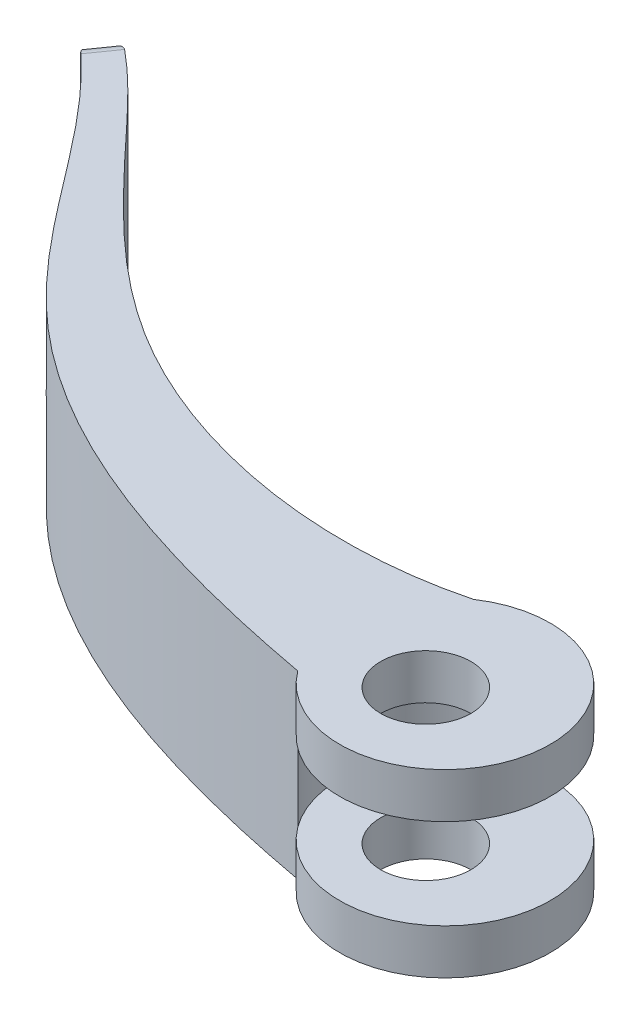
ISO-10303-21;
HEADER;
FILE_DESCRIPTION(('STEP AP214'),'2;1');
FILE_NAME('part.step','',(''),(''),'','','');
FILE_SCHEMA(('AUTOMOTIVE_DESIGN { 1 0 10303 214 1 1 1 1 }'));
ENDSEC;
DATA;
#1=APPLICATION_CONTEXT('core data for automotive mechanical design processes');
#2=APPLICATION_PROTOCOL_DEFINITION('international standard','automotive_design',2000,#1);
#3=PRODUCT_CONTEXT('',#1,'mechanical');
#4=PRODUCT('Part','Part','',(#3));
#5=PRODUCT_RELATED_PRODUCT_CATEGORY('part','',(#4));
#6=PRODUCT_DEFINITION_FORMATION('','',#4);
#7=PRODUCT_DEFINITION_CONTEXT('part definition',#1,'design');
#8=PRODUCT_DEFINITION('design','',#6,#7);
#9=PRODUCT_DEFINITION_SHAPE('','',#8);
#10=(LENGTH_UNIT() NAMED_UNIT(*) SI_UNIT(.MILLI.,.METRE.));
#11=(NAMED_UNIT(*) PLANE_ANGLE_UNIT() SI_UNIT($,.RADIAN.));
#12=(NAMED_UNIT(*) SI_UNIT($,.STERADIAN.) SOLID_ANGLE_UNIT());
#13=UNCERTAINTY_MEASURE_WITH_UNIT(LENGTH_MEASURE(1.E-05),#10,'distance_accuracy_value','');
#14=(GEOMETRIC_REPRESENTATION_CONTEXT(3) GLOBAL_UNCERTAINTY_ASSIGNED_CONTEXT((#13)) GLOBAL_UNIT_ASSIGNED_CONTEXT((#10,
#11,#12)) REPRESENTATION_CONTEXT('',''));
#15=CARTESIAN_POINT('',(0.,0.,0.));
#16=DIRECTION('',(0.,0.,1.));
#17=DIRECTION('',(1.,0.,0.));
#18=AXIS2_PLACEMENT_3D('',#15,#16,#17);
#19=CARTESIAN_POINT('',(0.,12.,0.));
#20=DIRECTION('',(0.,-1.,0.));
#21=DIRECTION('',(0.,0.,-1.));
#22=AXIS2_PLACEMENT_3D('',#19,#20,#21);
#23=CYLINDRICAL_SURFACE('',#22,7.);
#24=DIRECTION('',(0.,-1.,0.));
#25=VECTOR('',#24,1.);
#26=CARTESIAN_POINT('',(-3.90861040379885,12.,-5.80713050579332));
#27=LINE('',#26,#25);
#28=CARTESIAN_POINT('',(-3.90861040379885,9.,-5.80713050579332));
#29=VERTEX_POINT('',#28);
#30=CARTESIAN_POINT('',(-3.90861040379885,3.,-5.80713050579332));
#31=VERTEX_POINT('',#30);
#32=EDGE_CURVE('E229',#29,#31,#27,.T.);
#33=ORIENTED_EDGE('',*,*,#32,.F.);
#34=CARTESIAN_POINT('',(0.,9.,0.));
#35=DIRECTION('',(0.,1.,0.));
#36=DIRECTION('',(0.,0.,1.));
#37=AXIS2_PLACEMENT_3D('',#34,#35,#36);
#38=CIRCLE('',#37,7.);
#39=CARTESIAN_POINT('',(-5.63038455934891,9.,4.15917897112464));
#40=VERTEX_POINT('',#39);
#41=EDGE_CURVE('E147',#29,#40,#38,.T.);
#42=ORIENTED_EDGE('',*,*,#41,.T.);
#43=DIRECTION('',(0.,-1.,0.));
#44=VECTOR('',#43,1.);
#45=CARTESIAN_POINT('',(-5.63038455934891,12.,4.15917897112464));
#46=LINE('',#45,#44);
#47=CARTESIAN_POINT('',(-5.63038455934891,3.,4.15917897112464));
#48=VERTEX_POINT('',#47);
#49=EDGE_CURVE('E134',#40,#48,#46,.T.);
#50=ORIENTED_EDGE('',*,*,#49,.T.);
#51=CARTESIAN_POINT('',(0.,3.,0.));
#52=DIRECTION('',(0.,1.,0.));
#53=DIRECTION('',(0.,0.,1.));
#54=AXIS2_PLACEMENT_3D('',#51,#52,#53);
#55=CIRCLE('',#54,7.);
#56=EDGE_CURVE('E159',#31,#48,#55,.T.);
#57=ORIENTED_EDGE('',*,*,#56,.F.);
#58=EDGE_LOOP('',(#33,#42,#50,#57));
#59=FACE_BOUND('',#58,.T.);
#60=ADVANCED_FACE('F43',(#59),#23,.F.);
#61=CARTESIAN_POINT('',(-44.5893770504058,12.,-31.3195726277203));
#62=DIRECTION('',(0.818308254116617,0.,0.57477961102027));
#63=DIRECTION('',(0.57477961102027,0.,-0.818308254116617));
#64=AXIS2_PLACEMENT_3D('',#61,#62,#63);
#65=PLANE('',#64);
#66=DIRECTION('',(-0.57477961102027,0.,0.818308254116617));
#67=VECTOR('',#66,1.);
#68=CARTESIAN_POINT('',(-47.9872952444347,11.,-26.4819888796621));
#69=LINE('',#68,#67);
#70=CARTESIAN_POINT('',(-48.6260177744178,11.,-25.5726457012435));
#71=VERTEX_POINT('',#70);
#72=CARTESIAN_POINT('',(-48.5827554730586,11.,-25.6342378273655));
#73=VERTEX_POINT('',#72);
#74=EDGE_CURVE('E390',#71,#73,#69,.F.);
#75=ORIENTED_EDGE('',*,*,#74,.T.);
#76=DIRECTION('',(0.,-1.,0.));
#77=VECTOR('',#76,1.);
#78=CARTESIAN_POINT('',(-48.5827554730586,12.,-25.6342378273655));
#79=LINE('',#78,#77);
#80=CARTESIAN_POINT('',(-48.5827554730586,1.,-25.6342378273655));
#81=VERTEX_POINT('',#80);
#82=EDGE_CURVE('E387',#73,#81,#79,.T.);
#83=ORIENTED_EDGE('',*,*,#82,.T.);
#84=DIRECTION('',(-0.57477961102027,0.,0.818308254116617));
#85=VECTOR('',#84,1.);
#86=CARTESIAN_POINT('',(-44.5893770504058,1.,-31.3195726277203));
#87=LINE('',#86,#85);
#88=CARTESIAN_POINT('',(-48.6260177744178,1.,-25.5726457012435));
#89=VERTEX_POINT('',#88);
#90=EDGE_CURVE('E138',#81,#89,#87,.T.);
#91=ORIENTED_EDGE('',*,*,#90,.T.);
#92=DIRECTION('',(0.,-1.,0.));
#93=VECTOR('',#92,1.);
#94=CARTESIAN_POINT('',(-48.6260177744178,12.,-25.5726457012435));
#95=LINE('',#94,#93);
#96=EDGE_CURVE('E372',#89,#71,#95,.F.);
#97=ORIENTED_EDGE('',*,*,#96,.T.);
#98=EDGE_LOOP('',(#75,#83,#91,#97));
#99=FACE_BOUND('',#98,.T.);
#100=ADVANCED_FACE('F189',(#99),#65,.F.);
#101=CARTESIAN_POINT('',(-49.1368544664753,12.,-24.8453723714289));
#102=CARTESIAN_POINT('',(-44.8088827793375,12.,-21.0865027980637));
#103=CARTESIAN_POINT('',(-40.7588190828675,12.,-14.5144830318843));
#104=CARTESIAN_POINT('',(-28.4427027708269,12.,-1.36293619522041));
#105=CARTESIAN_POINT('',(-15.6287580696251,12.,2.30796027114866));
#106=CARTESIAN_POINT('',(-5.63038455934891,12.,4.15917897112464));
#107=B_SPLINE_CURVE_WITH_KNOTS('',3,(#101,#102,#103,#104,#105,#106),.UNSPECIFIED.,.F.,.F.,(4,1,
1,4),(0.,0.315330411179741,0.428800604638553,1.),.UNSPECIFIED.);
#108=DIRECTION('',(0.,-1.,0.));
#109=VECTOR('',#108,1.);
#110=SURFACE_OF_LINEAR_EXTRUSION('',#107,#109);
#111=CARTESIAN_POINT('',(-48.3876960997107,12.,-24.1721447248371));
#112=VERTEX_POINT('',#111);
#113=CARTESIAN_POINT('',(-5.63038455934891,12.,4.15917897112464));
#114=VERTEX_POINT('',#113);
#115=EDGE_CURVE('E117',#112,#114,#107,.T.);
#116=ORIENTED_EDGE('',*,*,#115,.F.);
#117=CARTESIAN_POINT('',(-48.3876960997107,12.,-24.1721447248372));
#118=CARTESIAN_POINT('',(-48.4039805215978,11.9999989486895,-24.1872718974303));
#119=CARTESIAN_POINT('',(-48.4202461472935,11.9992737020706,-24.2023495428294));
#120=CARTESIAN_POINT('',(-48.4527398063021,11.9963748182161,-24.2324057792396));
#121=CARTESIAN_POINT('',(-48.468967839615,11.9942011809804,-24.2473843702506));
#122=CARTESIAN_POINT('',(-48.4851770767365,11.9913033484363,-24.2623134340676));
#123=B_SPLINE_CURVE_WITH_KNOTS('',3,(#117,#118,#119,#120,#121,#122),.UNSPECIFIED.,.F.,.F.,(4,2,
4),(0.,0.0665724235281247,0.133144847056246),.UNSPECIFIED.);
#124=CARTESIAN_POINT('',(-48.4851770767365,11.9913033484363,-24.2623134340676));
#125=VERTEX_POINT('',#124);
#126=EDGE_CURVE('E12',#112,#125,#123,.T.);
#127=ORIENTED_EDGE('',*,*,#126,.T.);
#128=DIRECTION('',(0.,-1.,0.));
#129=VECTOR('',#128,1.);
#130=CARTESIAN_POINT('',(-48.4851770767365,12.,-24.2623134340676));
#131=LINE('',#130,#129);
#132=CARTESIAN_POINT('',(-48.4851770767365,0.00869665156371345,-24.2623134340676));
#133=VERTEX_POINT('',#132);
#134=EDGE_CURVE('E52',#125,#133,#131,.T.);
#135=ORIENTED_EDGE('',*,*,#134,.T.);
#136=CARTESIAN_POINT('',(-48.4851770767365,0.00869665156371345,-24.2623134340676));
#137=CARTESIAN_POINT('',(-48.468967839615,0.00579881901961597,-24.2473843702506));
#138=CARTESIAN_POINT('',(-48.4527398063021,0.00362518178392379,-24.2324057792396));
#139=CARTESIAN_POINT('',(-48.4202461472935,0.000726297929350095,-24.2023495428294));
#140=CARTESIAN_POINT('',(-48.4039805215978,1.05131046852138E-06,-24.1872718974303));
#141=CARTESIAN_POINT('',(-48.3876960997107,0.,-24.1721447248371));
#142=B_SPLINE_CURVE_WITH_KNOTS('',3,(#136,#137,#138,#139,#140,#141),.UNSPECIFIED.,.F.,.F.,(4,2,
4),(0.,0.0665724235281319,0.133144847056261),.UNSPECIFIED.);
#143=CARTESIAN_POINT('',(-48.3876960963881,0.,-24.1721447217506));
#144=VERTEX_POINT('',#143);
#145=EDGE_CURVE('E194',#133,#144,#142,.T.);
#146=ORIENTED_EDGE('',*,*,#145,.T.);
#147=CARTESIAN_POINT('',(-49.1368544664753,0.,-24.8453723714289));
#148=CARTESIAN_POINT('',(-44.8088827793375,0.,-21.0865027980637));
#149=CARTESIAN_POINT('',(-40.7588190828675,0.,-14.5144830318843));
#150=CARTESIAN_POINT('',(-28.4427027708269,0.,-1.36293619522041));
#151=CARTESIAN_POINT('',(-15.6287580696251,0.,2.30796027114866));
#152=CARTESIAN_POINT('',(-5.63038455934891,0.,4.15917897112464));
#153=B_SPLINE_CURVE_WITH_KNOTS('',3,(#147,#148,#149,#150,#151,#152),.UNSPECIFIED.,.F.,.F.,(4,1,
1,4),(0.,0.315330411179741,0.428800604638553,1.),.UNSPECIFIED.);
#154=CARTESIAN_POINT('',(-5.63038455934891,0.,4.15917897112464));
#155=VERTEX_POINT('',#154);
#156=EDGE_CURVE('E171',#144,#155,#153,.T.);
#157=ORIENTED_EDGE('',*,*,#156,.T.);
#158=DIRECTION('',(0.,-1.,0.));
#159=VECTOR('',#158,1.);
#160=CARTESIAN_POINT('',(-5.63038455934891,12.,4.15917897112464));
#161=LINE('',#160,#159);
#162=EDGE_CURVE('E169',#48,#155,#161,.T.);
#163=ORIENTED_EDGE('',*,*,#162,.F.);
#164=ORIENTED_EDGE('',*,*,#49,.F.);
#165=EDGE_CURVE('E131',#114,#40,#46,.T.);
#166=ORIENTED_EDGE('',*,*,#165,.F.);
#167=EDGE_LOOP('',(#116,#127,#135,#146,#157,#163,#164,#166));
#168=FACE_BOUND('',#167,.T.);
#169=ADVANCED_FACE('F132',(#168),#110,.F.);
#170=CARTESIAN_POINT('',(-3.90861040379885,12.,-5.80713050579332));
#171=CARTESIAN_POINT('',(-12.3800110490483,12.,-3.60562188356051));
#172=CARTESIAN_POINT('',(-27.3765794382472,12.,-6.3175591992749));
#173=CARTESIAN_POINT('',(-39.425413050532,12.,-17.7730453391979));
#174=CARTESIAN_POINT('',(-45.6587175545161,12.,-24.8463962138069));
#175=CARTESIAN_POINT('',(-47.9872952444347,12.,-26.4819888796621));
#176=B_SPLINE_CURVE_WITH_KNOTS('',3,(#170,#171,#172,#173,#174,#175),.UNSPECIFIED.,.F.,.F.,(4,1,
1,4),(0.,0.514096191177697,0.795654463109284,1.),.UNSPECIFIED.);
#177=DIRECTION('',(0.,-1.,0.));
#178=VECTOR('',#177,1.);
#179=SURFACE_OF_LINEAR_EXTRUSION('',#176,#178);
#180=CARTESIAN_POINT('',(-3.90861040379885,0.,-5.80713050579332));
#181=CARTESIAN_POINT('',(-12.3800110490483,0.,-3.60562188356051));
#182=CARTESIAN_POINT('',(-27.3765794382472,0.,-6.3175591992749));
#183=CARTESIAN_POINT('',(-39.425413050532,0.,-17.7730453391979));
#184=CARTESIAN_POINT('',(-45.6587175545161,0.,-24.8463962138069));
#185=CARTESIAN_POINT('',(-47.9872952444347,0.,-26.4819888796621));
#186=B_SPLINE_CURVE_WITH_KNOTS('',3,(#180,#181,#182,#183,#184,#185),.UNSPECIFIED.,.F.,.F.,(4,1,
1,4),(0.,0.514096191177697,0.795654463109284,1.),.UNSPECIFIED.);
#187=CARTESIAN_POINT('',(-3.90861040379885,0.,-5.80713050579332));
#188=VERTEX_POINT('',#187);
#189=CARTESIAN_POINT('',(-47.1359589404355,0.,-25.837277272283));
#190=VERTEX_POINT('',#189);
#191=EDGE_CURVE('E127',#188,#190,#186,.T.);
#192=ORIENTED_EDGE('',*,*,#191,.T.);
#193=DIRECTION('',(0.,-1.,0.));
#194=VECTOR('',#193,1.);
#195=CARTESIAN_POINT('',(-47.1359589404355,0.,-25.837277272283));
#196=LINE('',#195,#194);
#197=CARTESIAN_POINT('',(-47.1359589404355,12.,-25.837277272283));
#198=VERTEX_POINT('',#197);
#199=EDGE_CURVE('E380',#190,#198,#196,.F.);
#200=ORIENTED_EDGE('',*,*,#199,.T.);
#201=CARTESIAN_POINT('',(-3.90861040379885,12.,-5.80713050579332));
#202=VERTEX_POINT('',#201);
#203=EDGE_CURVE('E126',#202,#198,#176,.T.);
#204=ORIENTED_EDGE('',*,*,#203,.F.);
#205=EDGE_CURVE('E143',#202,#29,#27,.T.);
#206=ORIENTED_EDGE('',*,*,#205,.T.);
#207=ORIENTED_EDGE('',*,*,#32,.T.);
#208=DIRECTION('',(0.,-1.,0.));
#209=VECTOR('',#208,1.);
#210=CARTESIAN_POINT('',(-3.90861040379885,12.,-5.80713050579332));
#211=LINE('',#210,#209);
#212=EDGE_CURVE('E162',#188,#31,#211,.F.);
#213=ORIENTED_EDGE('',*,*,#212,.F.);
#214=EDGE_LOOP('',(#192,#200,#204,#206,#207,#213));
#215=FACE_BOUND('',#214,.T.);
#216=ADVANCED_FACE('F188',(#215),#179,.F.);
#217=CARTESIAN_POINT('',(0.,12.,0.));
#218=DIRECTION('',(0.,1.,0.));
#219=DIRECTION('',(0.,0.,1.));
#220=AXIS2_PLACEMENT_3D('',#217,#218,#219);
#221=PLANE('',#220);
#222=ORIENTED_EDGE('',*,*,#203,.T.);
#223=CARTESIAN_POINT('',(-47.764447218942,12.,-25.0594582163452));
#224=DIRECTION('',(0.,1.,0.));
#225=DIRECTION('',(0.,0.,1.));
#226=AXIS2_PLACEMENT_3D('',#223,#224,#225);
#227=CIRCLE('',#226,1.);
#228=CARTESIAN_POINT('',(-47.1896676079217,12.,-25.8777664704618));
#229=VERTEX_POINT('',#228);
#230=EDGE_CURVE('E379',#198,#229,#227,.T.);
#231=ORIENTED_EDGE('',*,*,#230,.T.);
#232=DIRECTION('',(-0.57477961102027,0.,0.818308254116617));
#233=VECTOR('',#232,1.);
#234=CARTESIAN_POINT('',(-48.3185462123586,12.,-24.2705927604086));
#235=LINE('',#234,#233);
#236=EDGE_CURVE('E125',#229,#112,#235,.T.);
#237=ORIENTED_EDGE('',*,*,#236,.T.);
#238=ORIENTED_EDGE('',*,*,#115,.T.);
#239=CARTESIAN_POINT('',(0.,12.,0.));
#240=DIRECTION('',(0.,1.,0.));
#241=DIRECTION('',(0.,0.,1.));
#242=AXIS2_PLACEMENT_3D('',#239,#240,#241);
#243=CIRCLE('',#242,7.);
#244=EDGE_CURVE('E123',#114,#202,#243,.T.);
#245=ORIENTED_EDGE('',*,*,#244,.T.);
#246=EDGE_LOOP('',(#222,#231,#237,#238,#245));
#247=FACE_BOUND('',#246,.T.);
#248=CARTESIAN_POINT('',(-0.421324481912509,12.,0.852481629393174));
#249=DIRECTION('',(0.,1.,0.));
#250=DIRECTION('',(0.,0.,1.));
#251=AXIS2_PLACEMENT_3D('',#248,#249,#250);
#252=CIRCLE('',#251,3.);
#253=CARTESIAN_POINT('',(-0.421324481912509,12.,3.85248162939317));
#254=VERTEX_POINT('',#253);
#255=EDGE_CURVE('E150',#254,#254,#252,.T.);
#256=ORIENTED_EDGE('',*,*,#255,.F.);
#257=EDGE_LOOP('',(#256));
#258=FACE_BOUND('',#257,.T.);
#259=ADVANCED_FACE('F120',(#247,#258),#221,.T.);
#260=CARTESIAN_POINT('',(0.,0.,0.));
#261=DIRECTION('',(0.,1.,0.));
#262=DIRECTION('',(0.,0.,1.));
#263=AXIS2_PLACEMENT_3D('',#260,#261,#262);
#264=PLANE('',#263);
#265=DIRECTION('',(-0.57477961102027,0.,0.818308254116617));
#266=VECTOR('',#265,1.);
#267=CARTESIAN_POINT('',(-43.7710687962892,0.,-30.7447930167001));
#268=LINE('',#267,#266);
#269=CARTESIAN_POINT('',(-47.1896676079217,0.,-25.8777664704618));
#270=VERTEX_POINT('',#269);
#271=EDGE_CURVE('E377',#144,#270,#268,.F.);
#272=ORIENTED_EDGE('',*,*,#271,.T.);
#273=CARTESIAN_POINT('',(-47.764447218942,0.,-25.0594582163452));
#274=DIRECTION('',(0.,1.,0.));
#275=DIRECTION('',(0.,0.,1.));
#276=AXIS2_PLACEMENT_3D('',#273,#274,#275);
#277=CIRCLE('',#276,1.);
#278=EDGE_CURVE('E384',#270,#190,#277,.F.);
#279=ORIENTED_EDGE('',*,*,#278,.T.);
#280=ORIENTED_EDGE('',*,*,#191,.F.);
#281=CARTESIAN_POINT('',(0.,0.,0.));
#282=DIRECTION('',(0.,1.,0.));
#283=DIRECTION('',(0.,0.,1.));
#284=AXIS2_PLACEMENT_3D('',#281,#282,#283);
#285=CIRCLE('',#284,7.);
#286=EDGE_CURVE('E158',#155,#188,#285,.T.);
#287=ORIENTED_EDGE('',*,*,#286,.F.);
#288=ORIENTED_EDGE('',*,*,#156,.F.);
#289=EDGE_LOOP('',(#272,#279,#280,#287,#288));
#290=FACE_BOUND('',#289,.T.);
#291=CARTESIAN_POINT('',(-0.421324481912509,0.,0.852481629393174));
#292=DIRECTION('',(0.,1.,0.));
#293=DIRECTION('',(0.,0.,1.));
#294=AXIS2_PLACEMENT_3D('',#291,#292,#293);
#295=CIRCLE('',#294,3.);
#296=CARTESIAN_POINT('',(-0.421324481912509,0.,3.85248162939317));
#297=VERTEX_POINT('',#296);
#298=EDGE_CURVE('E163',#297,#297,#295,.T.);
#299=ORIENTED_EDGE('',*,*,#298,.T.);
#300=EDGE_LOOP('',(#299));
#301=FACE_BOUND('',#300,.T.);
#302=ADVANCED_FACE('F258',(#290,#301),#264,.F.);
#303=CARTESIAN_POINT('',(0.,3.,0.));
#304=DIRECTION('',(0.,-1.,0.));
#305=DIRECTION('',(0.,0.,-1.));
#306=AXIS2_PLACEMENT_3D('',#303,#304,#305);
#307=CYLINDRICAL_SURFACE('',#306,7.);
#308=EDGE_CURVE('E157',#48,#31,#55,.T.);
#309=ORIENTED_EDGE('',*,*,#308,.F.);
#310=ORIENTED_EDGE('',*,*,#162,.T.);
#311=ORIENTED_EDGE('',*,*,#286,.T.);
#312=ORIENTED_EDGE('',*,*,#212,.T.);
#313=EDGE_LOOP('',(#309,#310,#311,#312));
#314=FACE_BOUND('',#313,.T.);
#315=ADVANCED_FACE('F255',(#314),#307,.T.);
#316=CARTESIAN_POINT('',(-0.421324481912509,3.,0.852481629393174));
#317=DIRECTION('',(0.,-1.,0.));
#318=DIRECTION('',(0.,0.,-1.));
#319=AXIS2_PLACEMENT_3D('',#316,#317,#318);
#320=CYLINDRICAL_SURFACE('',#319,3.);
#321=CARTESIAN_POINT('',(-0.421324481912509,3.,0.852481629393174));
#322=DIRECTION('',(0.,1.,0.));
#323=DIRECTION('',(0.,0.,1.));
#324=AXIS2_PLACEMENT_3D('',#321,#322,#323);
#325=CIRCLE('',#324,3.);
#326=CARTESIAN_POINT('',(-0.421324481912509,3.,3.85248162939317));
#327=VERTEX_POINT('',#326);
#328=EDGE_CURVE('E154',#327,#327,#325,.T.);
#329=ORIENTED_EDGE('',*,*,#328,.T.);
#330=EDGE_LOOP('',(#329));
#331=FACE_BOUND('',#330,.T.);
#332=ORIENTED_EDGE('',*,*,#298,.F.);
#333=EDGE_LOOP('',(#332));
#334=FACE_BOUND('',#333,.T.);
#335=ADVANCED_FACE('F253',(#331,#334),#320,.F.);
#336=CARTESIAN_POINT('',(0.,3.,0.));
#337=DIRECTION('',(0.,1.,0.));
#338=DIRECTION('',(0.,0.,1.));
#339=AXIS2_PLACEMENT_3D('',#336,#337,#338);
#340=PLANE('',#339);
#341=ORIENTED_EDGE('',*,*,#328,.F.);
#342=EDGE_LOOP('',(#341));
#343=FACE_BOUND('',#342,.T.);
#344=ORIENTED_EDGE('',*,*,#56,.T.);
#345=ORIENTED_EDGE('',*,*,#308,.T.);
#346=EDGE_LOOP('',(#344,#345));
#347=FACE_BOUND('',#346,.T.);
#348=ADVANCED_FACE('F248',(#343,#347),#340,.T.);
#349=CARTESIAN_POINT('',(0.,9.,0.));
#350=DIRECTION('',(0.,1.,0.));
#351=DIRECTION('',(0.,0.,1.));
#352=AXIS2_PLACEMENT_3D('',#349,#350,#351);
#353=CYLINDRICAL_SURFACE('',#352,7.);
#354=ORIENTED_EDGE('',*,*,#165,.T.);
#355=EDGE_CURVE('E144',#40,#29,#38,.T.);
#356=ORIENTED_EDGE('',*,*,#355,.T.);
#357=ORIENTED_EDGE('',*,*,#205,.F.);
#358=ORIENTED_EDGE('',*,*,#244,.F.);
#359=EDGE_LOOP('',(#354,#356,#357,#358));
#360=FACE_BOUND('',#359,.T.);
#361=ADVANCED_FACE('F141',(#360),#353,.T.);
#362=CARTESIAN_POINT('',(0.,9.,0.));
#363=DIRECTION('',(0.,1.,0.));
#364=DIRECTION('',(0.,0.,1.));
#365=AXIS2_PLACEMENT_3D('',#362,#363,#364);
#366=PLANE('',#365);
#367=CARTESIAN_POINT('',(-0.421324481912509,9.,0.852481629393174));
#368=DIRECTION('',(0.,1.,0.));
#369=DIRECTION('',(0.,0.,1.));
#370=AXIS2_PLACEMENT_3D('',#367,#368,#369);
#371=CIRCLE('',#370,3.);
#372=CARTESIAN_POINT('',(-0.421324481912509,9.,3.85248162939317));
#373=VERTEX_POINT('',#372);
#374=EDGE_CURVE('E145',#373,#373,#371,.T.);
#375=ORIENTED_EDGE('',*,*,#374,.T.);
#376=EDGE_LOOP('',(#375));
#377=FACE_BOUND('',#376,.T.);
#378=ORIENTED_EDGE('',*,*,#41,.F.);
#379=ORIENTED_EDGE('',*,*,#355,.F.);
#380=EDGE_LOOP('',(#378,#379));
#381=FACE_BOUND('',#380,.T.);
#382=ADVANCED_FACE('F237',(#377,#381),#366,.F.);
#383=CARTESIAN_POINT('',(-0.421324481912509,9.,0.852481629393174));
#384=DIRECTION('',(0.,1.,0.));
#385=DIRECTION('',(0.,0.,1.));
#386=AXIS2_PLACEMENT_3D('',#383,#384,#385);
#387=CYLINDRICAL_SURFACE('',#386,3.);
#388=ORIENTED_EDGE('',*,*,#374,.F.);
#389=EDGE_LOOP('',(#388));
#390=FACE_BOUND('',#389,.T.);
#391=ORIENTED_EDGE('',*,*,#255,.T.);
#392=EDGE_LOOP('',(#391));
#393=FACE_BOUND('',#392,.T.);
#394=ADVANCED_FACE('F239',(#390,#393),#387,.F.);
#395=CARTESIAN_POINT('',(-47.8077095203012,6.,-24.9978660902232));
#396=DIRECTION('',(0.,-1.,0.));
#397=DIRECTION('',(0.,0.,-1.));
#398=AXIS2_PLACEMENT_3D('',#395,#396,#397);
#399=CYLINDRICAL_SURFACE('',#398,1.);
#400=CARTESIAN_POINT('',(-47.8077095203012,1.,-24.9978660902232));
#401=DIRECTION('',(-0.406430560640199,0.707106781186547,0.578631315586785));
#402=DIRECTION('',(-0.406430560640199,-0.707106781186547,0.578631315586785));
#403=AXIS2_PLACEMENT_3D('',#400,#401,#402);
#404=ELLIPSE('',#403,1.41421356237309,1.);
#405=EDGE_CURVE('E368',#133,#89,#404,.F.);
#406=ORIENTED_EDGE('',*,*,#405,.F.);
#407=ORIENTED_EDGE('',*,*,#134,.F.);
#408=CARTESIAN_POINT('',(-47.8077095203012,11.,-24.9978660902232));
#409=DIRECTION('',(-0.406430560640199,-0.707106781186547,0.578631315586785));
#410=DIRECTION('',(0.406430560640199,-0.707106781186547,-0.578631315586785));
#411=AXIS2_PLACEMENT_3D('',#408,#409,#410);
#412=ELLIPSE('',#411,1.41421356237309,1.);
#413=EDGE_CURVE('E47',#71,#125,#412,.F.);
#414=ORIENTED_EDGE('',*,*,#413,.F.);
#415=ORIENTED_EDGE('',*,*,#96,.F.);
#416=EDGE_LOOP('',(#406,#407,#414,#415));
#417=FACE_BOUND('',#416,.T.);
#418=ADVANCED_FACE('F45',(#417),#399,.T.);
#419=CARTESIAN_POINT('',(-43.7710687962892,11.,-30.7447930167001));
#420=DIRECTION('',(0.57477961102027,0.,-0.818308254116617));
#421=DIRECTION('',(-0.818308254116617,0.,-0.57477961102027));
#422=AXIS2_PLACEMENT_3D('',#419,#420,#421);
#423=CYLINDRICAL_SURFACE('',#422,1.);
#424=ORIENTED_EDGE('',*,*,#126,.F.);
#425=ORIENTED_EDGE('',*,*,#236,.F.);
#426=CARTESIAN_POINT('',(-47.7644472189419,11.,-25.0594582163452));
#427=DIRECTION('',(0.406430560640199,-0.707106781186547,-0.578631315586785));
#428=DIRECTION('',(0.406430560640199,0.707106781186547,-0.578631315586785));
#429=AXIS2_PLACEMENT_3D('',#426,#427,#428);
#430=ELLIPSE('',#429,1.41421356237309,1.);
#431=EDGE_CURVE('E374',#73,#229,#430,.T.);
#432=ORIENTED_EDGE('',*,*,#431,.F.);
#433=ORIENTED_EDGE('',*,*,#74,.F.);
#434=ORIENTED_EDGE('',*,*,#413,.T.);
#435=EDGE_LOOP('',(#424,#425,#432,#433,#434));
#436=FACE_BOUND('',#435,.T.);
#437=ADVANCED_FACE('F209',(#436),#423,.T.);
#438=CARTESIAN_POINT('',(-43.7710687962892,1.,-30.7447930167001));
#439=DIRECTION('',(-0.57477961102027,0.,0.818308254116617));
#440=DIRECTION('',(0.818308254116617,0.,0.57477961102027));
#441=AXIS2_PLACEMENT_3D('',#438,#439,#440);
#442=CYLINDRICAL_SURFACE('',#441,1.);
#443=ORIENTED_EDGE('',*,*,#405,.T.);
#444=ORIENTED_EDGE('',*,*,#90,.F.);
#445=CARTESIAN_POINT('',(-47.764447218942,1.,-25.0594582163452));
#446=DIRECTION('',(-0.406430560640199,-0.707106781186547,0.578631315586785));
#447=DIRECTION('',(-0.406430560640199,0.707106781186547,0.578631315586785));
#448=AXIS2_PLACEMENT_3D('',#445,#446,#447);
#449=ELLIPSE('',#448,1.41421356237309,1.);
#450=EDGE_CURVE('E207',#270,#81,#449,.F.);
#451=ORIENTED_EDGE('',*,*,#450,.F.);
#452=ORIENTED_EDGE('',*,*,#271,.F.);
#453=ORIENTED_EDGE('',*,*,#145,.F.);
#454=EDGE_LOOP('',(#443,#444,#451,#452,#453));
#455=FACE_BOUND('',#454,.T.);
#456=ADVANCED_FACE('F212',(#455),#442,.T.);
#457=CARTESIAN_POINT('',(-47.764447218942,6.,-25.0594582163452));
#458=DIRECTION('',(0.,-1.,0.));
#459=DIRECTION('',(0.,0.,-1.));
#460=AXIS2_PLACEMENT_3D('',#457,#458,#459);
#461=CYLINDRICAL_SURFACE('',#460,1.);
#462=ORIENTED_EDGE('',*,*,#230,.F.);
#463=ORIENTED_EDGE('',*,*,#199,.F.);
#464=ORIENTED_EDGE('',*,*,#278,.F.);
#465=ORIENTED_EDGE('',*,*,#450,.T.);
#466=ORIENTED_EDGE('',*,*,#82,.F.);
#467=ORIENTED_EDGE('',*,*,#431,.T.);
#468=EDGE_LOOP('',(#462,#463,#464,#465,#466,#467));
#469=FACE_BOUND('',#468,.T.);
#470=ADVANCED_FACE('F216',(#469),#461,.T.);
#471=CLOSED_SHELL('',(#60,#100,#169,#216,#259,#302,#315,#335,#348,#361,#382,#394,#418,#437,#456,#470));
#472=MANIFOLD_SOLID_BREP('B2',#471);
#473=ADVANCED_BREP_SHAPE_REPRESENTATION('',(#18,#472),#14);
#474=SHAPE_DEFINITION_REPRESENTATION(#9,#473);
ENDSEC;
END-ISO-10303-21;
